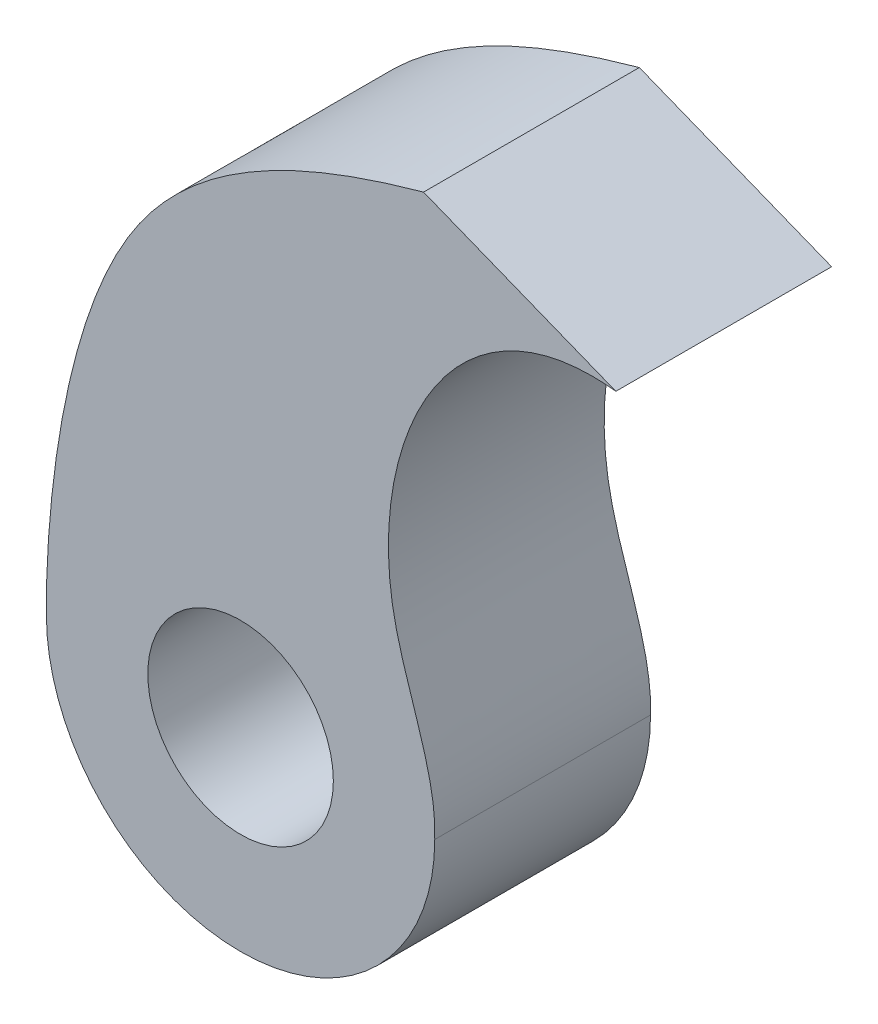
ISO-10303-21;
HEADER;
FILE_DESCRIPTION(('STEP AP214'),'2;1');
FILE_NAME('part.step','',(''),(''),'','','');
FILE_SCHEMA(('AUTOMOTIVE_DESIGN { 1 0 10303 214 1 1 1 1 }'));
ENDSEC;
DATA;
#1=APPLICATION_CONTEXT('core data for automotive mechanical design processes');
#2=APPLICATION_PROTOCOL_DEFINITION('international standard','automotive_design',2000,#1);
#3=PRODUCT_CONTEXT('',#1,'mechanical');
#4=PRODUCT('Part','Part','',(#3));
#5=PRODUCT_RELATED_PRODUCT_CATEGORY('part','',(#4));
#6=PRODUCT_DEFINITION_FORMATION('','',#4);
#7=PRODUCT_DEFINITION_CONTEXT('part definition',#1,'design');
#8=PRODUCT_DEFINITION('design','',#6,#7);
#9=PRODUCT_DEFINITION_SHAPE('','',#8);
#10=(LENGTH_UNIT() NAMED_UNIT(*) SI_UNIT(.MILLI.,.METRE.));
#11=(NAMED_UNIT(*) PLANE_ANGLE_UNIT() SI_UNIT($,.RADIAN.));
#12=(NAMED_UNIT(*) SI_UNIT($,.STERADIAN.) SOLID_ANGLE_UNIT());
#13=UNCERTAINTY_MEASURE_WITH_UNIT(LENGTH_MEASURE(1.E-05),#10,'distance_accuracy_value','');
#14=(GEOMETRIC_REPRESENTATION_CONTEXT(3) GLOBAL_UNCERTAINTY_ASSIGNED_CONTEXT((#13)) GLOBAL_UNIT_ASSIGNED_CONTEXT((#10,
#11,#12)) REPRESENTATION_CONTEXT('',''));
#15=CARTESIAN_POINT('',(0.,0.,0.));
#16=DIRECTION('',(0.,0.,1.));
#17=DIRECTION('',(1.,0.,0.));
#18=AXIS2_PLACEMENT_3D('',#15,#16,#17);
#19=CARTESIAN_POINT('',(-18.9479246023497,44.4587840293674,10.));
#20=DIRECTION('',(0.,0.,-1.));
#21=DIRECTION('',(-1.,0.,0.));
#22=AXIS2_PLACEMENT_3D('',#19,#20,#21);
#23=PLANE('',#22);
#24=CARTESIAN_POINT('',(-17.1796193793213,30.4604552571535,10.));
#25=CARTESIAN_POINT('',(-17.0733267099208,33.2175321086049,10.));
#26=CARTESIAN_POINT('',(-22.0366876739594,41.8303288625077,10.));
#27=CARTESIAN_POINT('',(-16.3931228330778,53.5087996666083,10.));
#28=CARTESIAN_POINT('',(-8.78632127168219,52.6470173737138,10.));
#29=B_SPLINE_CURVE_WITH_KNOTS('',3,(#24,#25,#26,#27,#28),.UNSPECIFIED.,.F.,.F.,(4,1,4),(0.,
0.305227291868046,1.),.UNSPECIFIED.);
#30=CARTESIAN_POINT('',(-17.1796193793213,30.4604552571535,10.));
#31=VERTEX_POINT('',#30);
#32=CARTESIAN_POINT('',(-8.7863212716822,52.6470173737138,10.));
#33=VERTEX_POINT('',#32);
#34=EDGE_CURVE('E86',#31,#33,#29,.T.);
#35=ORIENTED_EDGE('',*,*,#34,.T.);
#36=DIRECTION('',(-0.929314359061356,0.36928961810804,0.));
#37=VECTOR('',#36,1.);
#38=CARTESIAN_POINT('',(-8.7863212716822,52.6470173737138,10.));
#39=LINE('',#38,#37);
#40=CARTESIAN_POINT('',(-17.697634827804,56.188182478819,10.));
#41=VERTEX_POINT('',#40);
#42=EDGE_CURVE('E81',#33,#41,#39,.T.);
#43=ORIENTED_EDGE('',*,*,#42,.T.);
#44=CARTESIAN_POINT('',(-17.697634827804,56.188182478819,10.));
#45=CARTESIAN_POINT('',(-23.1529620732591,54.6718715709867,10.));
#46=CARTESIAN_POINT('',(-34.2011691532156,49.7811657739509,10.));
#47=CARTESIAN_POINT('',(-35.2235188740454,33.9176698494142,10.));
#48=CARTESIAN_POINT('',(-35.1796193793213,30.4604552571535,10.));
#49=B_SPLINE_CURVE_WITH_KNOTS('',3,(#44,#45,#46,#47,#48),.UNSPECIFIED.,.F.,.F.,(4,1,4),(0.,
0.444494392118755,1.),.UNSPECIFIED.);
#50=CARTESIAN_POINT('',(-35.1796193793213,30.4604552571535,10.));
#51=VERTEX_POINT('',#50);
#52=EDGE_CURVE('E84',#41,#51,#49,.T.);
#53=ORIENTED_EDGE('',*,*,#52,.T.);
#54=CARTESIAN_POINT('',(-26.1796193793213,30.4604552571535,10.));
#55=DIRECTION('',(0.,0.,1.));
#56=DIRECTION('',(1.,0.,0.));
#57=AXIS2_PLACEMENT_3D('',#54,#55,#56);
#58=CIRCLE('',#57,9.);
#59=EDGE_CURVE('E51',#51,#31,#58,.T.);
#60=ORIENTED_EDGE('',*,*,#59,.T.);
#61=EDGE_LOOP('',(#35,#43,#53,#60));
#62=FACE_BOUND('',#61,.T.);
#63=CARTESIAN_POINT('',(-26.1796193793213,30.4604552571535,10.));
#64=DIRECTION('',(0.,0.,1.));
#65=DIRECTION('',(1.,0.,0.));
#66=AXIS2_PLACEMENT_3D('',#63,#64,#65);
#67=CIRCLE('',#66,4.3);
#68=CARTESIAN_POINT('',(-21.8796193793213,30.4604552571535,10.));
#69=VERTEX_POINT('',#68);
#70=EDGE_CURVE('E130',#69,#69,#67,.T.);
#71=ORIENTED_EDGE('',*,*,#70,.F.);
#72=EDGE_LOOP('',(#71));
#73=FACE_BOUND('',#72,.T.);
#74=ADVANCED_FACE('F33',(#62,#73),#23,.F.);
#75=CARTESIAN_POINT('',(-18.9479246023497,44.4587840293674,0.));
#76=DIRECTION('',(0.,0.,-1.));
#77=DIRECTION('',(-1.,0.,0.));
#78=AXIS2_PLACEMENT_3D('',#75,#76,#77);
#79=PLANE('',#78);
#80=CARTESIAN_POINT('',(-17.1796193793213,30.4604552571535,0.));
#81=CARTESIAN_POINT('',(-17.0733267099208,33.2175321086049,0.));
#82=CARTESIAN_POINT('',(-22.0366876739594,41.8303288625077,0.));
#83=CARTESIAN_POINT('',(-16.3931228330778,53.5087996666083,0.));
#84=CARTESIAN_POINT('',(-8.78632127168219,52.6470173737138,0.));
#85=B_SPLINE_CURVE_WITH_KNOTS('',3,(#80,#81,#82,#83,#84),.UNSPECIFIED.,.F.,.F.,(4,1,4),(0.,
0.305227291868046,1.),.UNSPECIFIED.);
#86=CARTESIAN_POINT('',(-17.1796193793213,30.4604552571535,0.));
#87=VERTEX_POINT('',#86);
#88=CARTESIAN_POINT('',(-8.7863212716822,52.6470173737138,0.));
#89=VERTEX_POINT('',#88);
#90=EDGE_CURVE('E136',#87,#89,#85,.T.);
#91=ORIENTED_EDGE('',*,*,#90,.F.);
#92=CARTESIAN_POINT('',(-26.1796193793213,30.4604552571535,0.));
#93=DIRECTION('',(0.,0.,1.));
#94=DIRECTION('',(1.,0.,0.));
#95=AXIS2_PLACEMENT_3D('',#92,#93,#94);
#96=CIRCLE('',#95,9.);
#97=CARTESIAN_POINT('',(-35.1796193793213,30.4604552571535,0.));
#98=VERTEX_POINT('',#97);
#99=EDGE_CURVE('E74',#98,#87,#96,.T.);
#100=ORIENTED_EDGE('',*,*,#99,.F.);
#101=CARTESIAN_POINT('',(-17.697634827804,56.188182478819,0.));
#102=CARTESIAN_POINT('',(-23.1529620732591,54.6718715709867,0.));
#103=CARTESIAN_POINT('',(-34.2011691532156,49.7811657739509,0.));
#104=CARTESIAN_POINT('',(-35.2235188740454,33.9176698494142,0.));
#105=CARTESIAN_POINT('',(-35.1796193793213,30.4604552571535,0.));
#106=B_SPLINE_CURVE_WITH_KNOTS('',3,(#101,#102,#103,#104,#105),.UNSPECIFIED.,.F.,.F.,(4,1,4),
(0.,0.444494392118755,1.),.UNSPECIFIED.);
#107=CARTESIAN_POINT('',(-17.697634827804,56.188182478819,0.));
#108=VERTEX_POINT('',#107);
#109=EDGE_CURVE('E68',#108,#98,#106,.T.);
#110=ORIENTED_EDGE('',*,*,#109,.F.);
#111=DIRECTION('',(-0.929314359061356,0.36928961810804,0.));
#112=VECTOR('',#111,1.);
#113=CARTESIAN_POINT('',(-8.7863212716822,52.6470173737138,0.));
#114=LINE('',#113,#112);
#115=EDGE_CURVE('E90',#89,#108,#114,.T.);
#116=ORIENTED_EDGE('',*,*,#115,.F.);
#117=EDGE_LOOP('',(#91,#100,#110,#116));
#118=FACE_BOUND('',#117,.T.);
#119=CARTESIAN_POINT('',(-26.1796193793213,30.4604552571535,0.));
#120=DIRECTION('',(0.,0.,1.));
#121=DIRECTION('',(1.,0.,0.));
#122=AXIS2_PLACEMENT_3D('',#119,#120,#121);
#123=CIRCLE('',#122,4.3);
#124=CARTESIAN_POINT('',(-21.8796193793213,30.4604552571535,0.));
#125=VERTEX_POINT('',#124);
#126=EDGE_CURVE('E133',#125,#125,#123,.T.);
#127=ORIENTED_EDGE('',*,*,#126,.T.);
#128=EDGE_LOOP('',(#127));
#129=FACE_BOUND('',#128,.T.);
#130=ADVANCED_FACE('F112',(#118,#129),#79,.T.);
#131=DIRECTION('',(0.,0.,-1.));
#132=VECTOR('',#131,1.);
#133=SURFACE_OF_LINEAR_EXTRUSION('',#29,#132);
#134=ORIENTED_EDGE('',*,*,#90,.T.);
#135=DIRECTION('',(0.,0.,-1.));
#136=VECTOR('',#135,1.);
#137=CARTESIAN_POINT('',(-8.7863212716822,52.6470173737138,10.));
#138=LINE('',#137,#136);
#139=EDGE_CURVE('E11',#33,#89,#138,.T.);
#140=ORIENTED_EDGE('',*,*,#139,.F.);
#141=ORIENTED_EDGE('',*,*,#34,.F.);
#142=DIRECTION('',(0.,0.,-1.));
#143=VECTOR('',#142,1.);
#144=CARTESIAN_POINT('',(-17.1796193793213,30.4604552571535,10.));
#145=LINE('',#144,#143);
#146=EDGE_CURVE('E94',#31,#87,#145,.T.);
#147=ORIENTED_EDGE('',*,*,#146,.T.);
#148=EDGE_LOOP('',(#134,#140,#141,#147));
#149=FACE_BOUND('',#148,.T.);
#150=ADVANCED_FACE('F35',(#149),#133,.F.);
#151=CARTESIAN_POINT('',(-8.7863212716822,52.6470173737138,10.));
#152=DIRECTION('',(-0.36928961810804,-0.929314359061356,0.));
#153=DIRECTION('',(0.929314359061356,-0.36928961810804,0.));
#154=AXIS2_PLACEMENT_3D('',#151,#152,#153);
#155=PLANE('',#154);
#156=ORIENTED_EDGE('',*,*,#115,.T.);
#157=DIRECTION('',(0.,0.,-1.));
#158=VECTOR('',#157,1.);
#159=CARTESIAN_POINT('',(-17.697634827804,56.188182478819,10.));
#160=LINE('',#159,#158);
#161=EDGE_CURVE('E43',#41,#108,#160,.T.);
#162=ORIENTED_EDGE('',*,*,#161,.F.);
#163=ORIENTED_EDGE('',*,*,#42,.F.);
#164=ORIENTED_EDGE('',*,*,#139,.T.);
#165=EDGE_LOOP('',(#156,#162,#163,#164));
#166=FACE_BOUND('',#165,.T.);
#167=ADVANCED_FACE('F89',(#166),#155,.F.);
#168=DIRECTION('',(0.,0.,-1.));
#169=VECTOR('',#168,1.);
#170=SURFACE_OF_LINEAR_EXTRUSION('',#49,#169);
#171=ORIENTED_EDGE('',*,*,#109,.T.);
#172=DIRECTION('',(0.,0.,-1.));
#173=VECTOR('',#172,1.);
#174=CARTESIAN_POINT('',(-35.1796193793213,30.4604552571535,10.));
#175=LINE('',#174,#173);
#176=EDGE_CURVE('E91',#51,#98,#175,.T.);
#177=ORIENTED_EDGE('',*,*,#176,.F.);
#178=ORIENTED_EDGE('',*,*,#52,.F.);
#179=ORIENTED_EDGE('',*,*,#161,.T.);
#180=EDGE_LOOP('',(#171,#177,#178,#179));
#181=FACE_BOUND('',#180,.T.);
#182=ADVANCED_FACE('F92',(#181),#170,.F.);
#183=CARTESIAN_POINT('',(-26.1796193793213,30.4604552571535,10.));
#184=DIRECTION('',(0.,0.,-1.));
#185=DIRECTION('',(-1.,0.,0.));
#186=AXIS2_PLACEMENT_3D('',#183,#184,#185);
#187=CYLINDRICAL_SURFACE('',#186,9.);
#188=ORIENTED_EDGE('',*,*,#99,.T.);
#189=ORIENTED_EDGE('',*,*,#146,.F.);
#190=ORIENTED_EDGE('',*,*,#59,.F.);
#191=ORIENTED_EDGE('',*,*,#176,.T.);
#192=EDGE_LOOP('',(#188,#189,#190,#191));
#193=FACE_BOUND('',#192,.T.);
#194=ADVANCED_FACE('F106',(#193),#187,.T.);
#195=CARTESIAN_POINT('',(-26.1796193793213,30.4604552571535,10.));
#196=DIRECTION('',(0.,0.,-1.));
#197=DIRECTION('',(-1.,0.,0.));
#198=AXIS2_PLACEMENT_3D('',#195,#196,#197);
#199=CYLINDRICAL_SURFACE('',#198,4.3);
#200=ORIENTED_EDGE('',*,*,#70,.T.);
#201=EDGE_LOOP('',(#200));
#202=FACE_BOUND('',#201,.T.);
#203=ORIENTED_EDGE('',*,*,#126,.F.);
#204=EDGE_LOOP('',(#203));
#205=FACE_BOUND('',#204,.T.);
#206=ADVANCED_FACE('F121',(#202,#205),#199,.F.);
#207=CLOSED_SHELL('',(#74,#130,#150,#167,#182,#194,#206));
#208=MANIFOLD_SOLID_BREP('B2',#207);
#209=ADVANCED_BREP_SHAPE_REPRESENTATION('',(#18,#208),#14);
#210=SHAPE_DEFINITION_REPRESENTATION(#9,#209);
ENDSEC;
END-ISO-10303-21;
